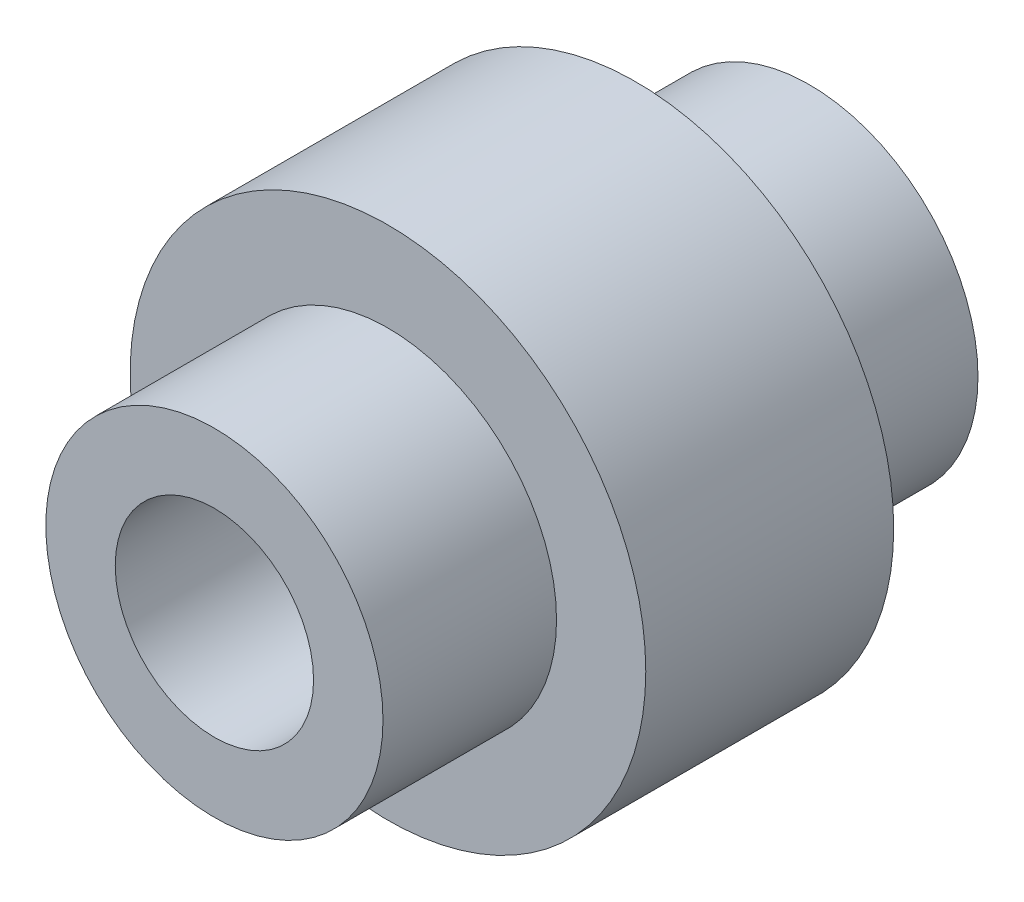
ISO-10303-21;
HEADER;
FILE_DESCRIPTION(('STEP AP214'),'2;1');
FILE_NAME('part.step','',(''),(''),'','','');
FILE_SCHEMA(('AUTOMOTIVE_DESIGN { 1 0 10303 214 1 1 1 1 }'));
ENDSEC;
DATA;
#1=APPLICATION_CONTEXT('core data for automotive mechanical design processes');
#2=APPLICATION_PROTOCOL_DEFINITION('international standard','automotive_design',2000,#1);
#3=PRODUCT_CONTEXT('',#1,'mechanical');
#4=PRODUCT('Part','Part','',(#3));
#5=PRODUCT_RELATED_PRODUCT_CATEGORY('part','',(#4));
#6=PRODUCT_DEFINITION_FORMATION('','',#4);
#7=PRODUCT_DEFINITION_CONTEXT('part definition',#1,'design');
#8=PRODUCT_DEFINITION('design','',#6,#7);
#9=PRODUCT_DEFINITION_SHAPE('','',#8);
#10=(LENGTH_UNIT() NAMED_UNIT(*) SI_UNIT(.MILLI.,.METRE.));
#11=(NAMED_UNIT(*) PLANE_ANGLE_UNIT() SI_UNIT($,.RADIAN.));
#12=(NAMED_UNIT(*) SI_UNIT($,.STERADIAN.) SOLID_ANGLE_UNIT());
#13=UNCERTAINTY_MEASURE_WITH_UNIT(LENGTH_MEASURE(1.E-05),#10,'distance_accuracy_value','');
#14=(GEOMETRIC_REPRESENTATION_CONTEXT(3) GLOBAL_UNCERTAINTY_ASSIGNED_CONTEXT((#13)) GLOBAL_UNIT_ASSIGNED_CONTEXT((#10,
#11,#12)) REPRESENTATION_CONTEXT('',''));
#15=CARTESIAN_POINT('',(0.,0.,0.));
#16=DIRECTION('',(0.,0.,1.));
#17=DIRECTION('',(1.,0.,0.));
#18=AXIS2_PLACEMENT_3D('',#15,#16,#17);
#19=CARTESIAN_POINT('',(0.,0.,60.));
#20=DIRECTION('',(0.,0.,-1.));
#21=DIRECTION('',(-1.,0.,0.));
#22=AXIS2_PLACEMENT_3D('',#19,#20,#21);
#23=CYLINDRICAL_SURFACE('',#22,20.);
#24=CARTESIAN_POINT('',(0.,0.,60.));
#25=DIRECTION('',(0.,0.,1.));
#26=DIRECTION('',(1.,0.,0.));
#27=AXIS2_PLACEMENT_3D('',#24,#25,#26);
#28=CIRCLE('',#27,20.);
#29=CARTESIAN_POINT('',(20.,0.,60.));
#30=VERTEX_POINT('',#29);
#31=EDGE_CURVE('E55',#30,#30,#28,.T.);
#32=ORIENTED_EDGE('',*,*,#31,.T.);
#33=EDGE_LOOP('',(#32));
#34=FACE_BOUND('',#33,.T.);
#35=CARTESIAN_POINT('',(0.,0.,-25.));
#36=DIRECTION('',(0.,0.,-1.));
#37=DIRECTION('',(-1.,0.,0.));
#38=AXIS2_PLACEMENT_3D('',#35,#36,#37);
#39=CIRCLE('',#38,20.);
#40=CARTESIAN_POINT('',(-20.,0.,-25.));
#41=VERTEX_POINT('',#40);
#42=EDGE_CURVE('E56',#41,#41,#39,.T.);
#43=ORIENTED_EDGE('',*,*,#42,.T.);
#44=EDGE_LOOP('',(#43));
#45=FACE_BOUND('',#44,.T.);
#46=ADVANCED_FACE('F34',(#34,#45),#23,.F.);
#47=CARTESIAN_POINT('',(0.,0.,25.));
#48=DIRECTION('',(0.,0.,-1.));
#49=DIRECTION('',(-1.,0.,0.));
#50=AXIS2_PLACEMENT_3D('',#47,#48,#49);
#51=CYLINDRICAL_SURFACE('',#50,52.);
#52=CARTESIAN_POINT('',(0.,0.,25.));
#53=DIRECTION('',(0.,0.,1.));
#54=DIRECTION('',(1.,0.,0.));
#55=AXIS2_PLACEMENT_3D('',#52,#53,#54);
#56=CIRCLE('',#55,52.);
#57=CARTESIAN_POINT('',(52.,0.,25.));
#58=VERTEX_POINT('',#57);
#59=EDGE_CURVE('E10',#58,#58,#56,.T.);
#60=ORIENTED_EDGE('',*,*,#59,.F.);
#61=EDGE_LOOP('',(#60));
#62=FACE_BOUND('',#61,.T.);
#63=CARTESIAN_POINT('',(0.,0.,-25.));
#64=DIRECTION('',(0.,0.,1.));
#65=DIRECTION('',(1.,0.,0.));
#66=AXIS2_PLACEMENT_3D('',#63,#64,#65);
#67=CIRCLE('',#66,52.);
#68=CARTESIAN_POINT('',(52.,0.,-25.));
#69=VERTEX_POINT('',#68);
#70=EDGE_CURVE('E38',#69,#69,#67,.T.);
#71=ORIENTED_EDGE('',*,*,#70,.T.);
#72=EDGE_LOOP('',(#71));
#73=FACE_BOUND('',#72,.T.);
#74=ADVANCED_FACE('F36',(#62,#73),#51,.T.);
#75=CARTESIAN_POINT('',(0.,-114.541421356237,25.));
#76=DIRECTION('',(0.,0.,1.));
#77=DIRECTION('',(1.,0.,0.));
#78=AXIS2_PLACEMENT_3D('',#75,#76,#77);
#79=PLANE('',#78);
#80=CARTESIAN_POINT('',(0.,0.,25.));
#81=DIRECTION('',(0.,0.,1.));
#82=DIRECTION('',(1.,0.,0.));
#83=AXIS2_PLACEMENT_3D('',#80,#81,#82);
#84=CIRCLE('',#83,34.);
#85=CARTESIAN_POINT('',(34.,0.,25.));
#86=VERTEX_POINT('',#85);
#87=EDGE_CURVE('E42',#86,#86,#84,.T.);
#88=ORIENTED_EDGE('',*,*,#87,.F.);
#89=EDGE_LOOP('',(#88));
#90=FACE_BOUND('',#89,.T.);
#91=ORIENTED_EDGE('',*,*,#59,.T.);
#92=EDGE_LOOP('',(#91));
#93=FACE_BOUND('',#92,.T.);
#94=ADVANCED_FACE('F100',(#90,#93),#79,.T.);
#95=CARTESIAN_POINT('',(0.,-114.541421356237,-25.));
#96=DIRECTION('',(0.,0.,1.));
#97=DIRECTION('',(1.,0.,0.));
#98=AXIS2_PLACEMENT_3D('',#95,#96,#97);
#99=PLANE('',#98);
#100=CARTESIAN_POINT('',(0.,0.,-25.));
#101=DIRECTION('',(0.,0.,1.));
#102=DIRECTION('',(1.,0.,0.));
#103=AXIS2_PLACEMENT_3D('',#100,#101,#102);
#104=CIRCLE('',#103,34.);
#105=CARTESIAN_POINT('',(34.,0.,-25.));
#106=VERTEX_POINT('',#105);
#107=EDGE_CURVE('E48',#106,#106,#104,.F.);
#108=ORIENTED_EDGE('',*,*,#107,.F.);
#109=EDGE_LOOP('',(#108));
#110=FACE_BOUND('',#109,.T.);
#111=ORIENTED_EDGE('',*,*,#70,.F.);
#112=EDGE_LOOP('',(#111));
#113=FACE_BOUND('',#112,.T.);
#114=ADVANCED_FACE('F105',(#110,#113),#99,.F.);
#115=CARTESIAN_POINT('',(0.,0.,60.));
#116=DIRECTION('',(0.,0.,-1.));
#117=DIRECTION('',(-1.,0.,0.));
#118=AXIS2_PLACEMENT_3D('',#115,#116,#117);
#119=CYLINDRICAL_SURFACE('',#118,34.);
#120=CARTESIAN_POINT('',(0.,0.,-60.));
#121=DIRECTION('',(0.,0.,1.));
#122=DIRECTION('',(1.,0.,0.));
#123=AXIS2_PLACEMENT_3D('',#120,#121,#122);
#124=CIRCLE('',#123,34.);
#125=CARTESIAN_POINT('',(34.,0.,-60.));
#126=VERTEX_POINT('',#125);
#127=EDGE_CURVE('E52',#126,#126,#124,.T.);
#128=ORIENTED_EDGE('',*,*,#127,.T.);
#129=EDGE_LOOP('',(#128));
#130=FACE_BOUND('',#129,.T.);
#131=ORIENTED_EDGE('',*,*,#107,.T.);
#132=EDGE_LOOP('',(#131));
#133=FACE_BOUND('',#132,.T.);
#134=ADVANCED_FACE('F108',(#130,#133),#119,.T.);
#135=ORIENTED_EDGE('',*,*,#87,.T.);
#136=EDGE_LOOP('',(#135));
#137=FACE_BOUND('',#136,.T.);
#138=CARTESIAN_POINT('',(0.,0.,60.));
#139=DIRECTION('',(0.,0.,1.));
#140=DIRECTION('',(1.,0.,0.));
#141=AXIS2_PLACEMENT_3D('',#138,#139,#140);
#142=CIRCLE('',#141,34.);
#143=CARTESIAN_POINT('',(34.,0.,60.));
#144=VERTEX_POINT('',#143);
#145=EDGE_CURVE('E51',#144,#144,#142,.T.);
#146=ORIENTED_EDGE('',*,*,#145,.F.);
#147=EDGE_LOOP('',(#146));
#148=FACE_BOUND('',#147,.T.);
#149=ADVANCED_FACE('F89',(#137,#148),#119,.T.);
#150=CARTESIAN_POINT('',(0.,-114.541421356237,60.));
#151=DIRECTION('',(0.,0.,1.));
#152=DIRECTION('',(1.,0.,0.));
#153=AXIS2_PLACEMENT_3D('',#150,#151,#152);
#154=PLANE('',#153);
#155=ORIENTED_EDGE('',*,*,#31,.F.);
#156=EDGE_LOOP('',(#155));
#157=FACE_BOUND('',#156,.T.);
#158=ORIENTED_EDGE('',*,*,#145,.T.);
#159=EDGE_LOOP('',(#158));
#160=FACE_BOUND('',#159,.T.);
#161=ADVANCED_FACE('F81',(#157,#160),#154,.T.);
#162=CARTESIAN_POINT('',(0.,-114.541421356237,-60.));
#163=DIRECTION('',(0.,0.,1.));
#164=DIRECTION('',(1.,0.,0.));
#165=AXIS2_PLACEMENT_3D('',#162,#163,#164);
#166=PLANE('',#165);
#167=ORIENTED_EDGE('',*,*,#127,.F.);
#168=EDGE_LOOP('',(#167));
#169=FACE_BOUND('',#168,.T.);
#170=CARTESIAN_POINT('',(0.,0.,-60.));
#171=DIRECTION('',(0.,0.,-1.));
#172=DIRECTION('',(-1.,0.,0.));
#173=AXIS2_PLACEMENT_3D('',#170,#171,#172);
#174=CIRCLE('',#173,11.);
#175=CARTESIAN_POINT('',(-11.,0.,-60.));
#176=VERTEX_POINT('',#175);
#177=EDGE_CURVE('E64',#176,#176,#174,.T.);
#178=ORIENTED_EDGE('',*,*,#177,.F.);
#179=EDGE_LOOP('',(#178));
#180=FACE_BOUND('',#179,.T.);
#181=ADVANCED_FACE('F79',(#169,#180),#166,.F.);
#182=CARTESIAN_POINT('',(0.,0.,-25.));
#183=DIRECTION('',(0.,0.,-1.));
#184=DIRECTION('',(-1.,0.,0.));
#185=AXIS2_PLACEMENT_3D('',#182,#183,#184);
#186=PLANE('',#185);
#187=CARTESIAN_POINT('',(0.,0.,-25.));
#188=DIRECTION('',(0.,0.,-1.));
#189=DIRECTION('',(-1.,0.,0.));
#190=AXIS2_PLACEMENT_3D('',#187,#188,#189);
#191=CIRCLE('',#190,11.);
#192=CARTESIAN_POINT('',(-11.,0.,-25.));
#193=VERTEX_POINT('',#192);
#194=EDGE_CURVE('E63',#193,#193,#191,.T.);
#195=ORIENTED_EDGE('',*,*,#194,.T.);
#196=EDGE_LOOP('',(#195));
#197=FACE_BOUND('',#196,.T.);
#198=ORIENTED_EDGE('',*,*,#42,.F.);
#199=EDGE_LOOP('',(#198));
#200=FACE_BOUND('',#199,.T.);
#201=ADVANCED_FACE('F70',(#197,#200),#186,.F.);
#202=CARTESIAN_POINT('',(0.,0.,-25.));
#203=DIRECTION('',(0.,0.,-1.));
#204=DIRECTION('',(-1.,0.,0.));
#205=AXIS2_PLACEMENT_3D('',#202,#203,#204);
#206=CYLINDRICAL_SURFACE('',#205,11.);
#207=ORIENTED_EDGE('',*,*,#194,.F.);
#208=EDGE_LOOP('',(#207));
#209=FACE_BOUND('',#208,.T.);
#210=ORIENTED_EDGE('',*,*,#177,.T.);
#211=EDGE_LOOP('',(#210));
#212=FACE_BOUND('',#211,.T.);
#213=ADVANCED_FACE('F73',(#209,#212),#206,.F.);
#214=CLOSED_SHELL('',(#46,#74,#94,#114,#134,#149,#161,#181,#201,#213));
#215=MANIFOLD_SOLID_BREP('B2',#214);
#216=ADVANCED_BREP_SHAPE_REPRESENTATION('',(#18,#215),#14);
#217=SHAPE_DEFINITION_REPRESENTATION(#9,#216);
ENDSEC;
END-ISO-10303-21;
